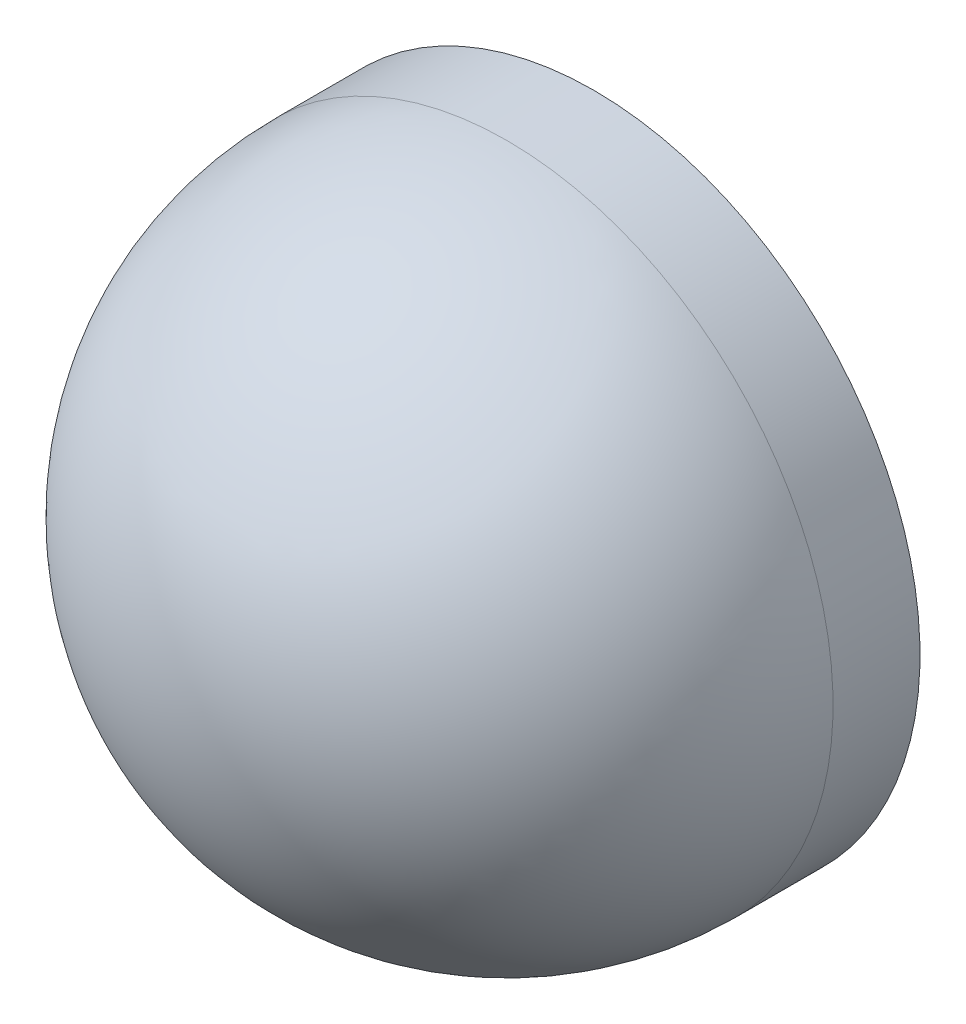
ISO-10303-21;
HEADER;
FILE_DESCRIPTION(('STEP AP214'),'2;1');
FILE_NAME('part.step','',(''),(''),'','','');
FILE_SCHEMA(('AUTOMOTIVE_DESIGN { 1 0 10303 214 1 1 1 1 }'));
ENDSEC;
DATA;
#1=APPLICATION_CONTEXT('core data for automotive mechanical design processes');
#2=APPLICATION_PROTOCOL_DEFINITION('international standard','automotive_design',2000,#1);
#3=PRODUCT_CONTEXT('',#1,'mechanical');
#4=PRODUCT('Part','Part','',(#3));
#5=PRODUCT_RELATED_PRODUCT_CATEGORY('part','',(#4));
#6=PRODUCT_DEFINITION_FORMATION('','',#4);
#7=PRODUCT_DEFINITION_CONTEXT('part definition',#1,'design');
#8=PRODUCT_DEFINITION('design','',#6,#7);
#9=PRODUCT_DEFINITION_SHAPE('','',#8);
#10=(LENGTH_UNIT() NAMED_UNIT(*) SI_UNIT(.MILLI.,.METRE.));
#11=(NAMED_UNIT(*) PLANE_ANGLE_UNIT() SI_UNIT($,.RADIAN.));
#12=(NAMED_UNIT(*) SI_UNIT($,.STERADIAN.) SOLID_ANGLE_UNIT());
#13=UNCERTAINTY_MEASURE_WITH_UNIT(LENGTH_MEASURE(1.E-05),#10,'distance_accuracy_value','');
#14=(GEOMETRIC_REPRESENTATION_CONTEXT(3) GLOBAL_UNCERTAINTY_ASSIGNED_CONTEXT((#13)) GLOBAL_UNIT_ASSIGNED_CONTEXT((#10,
#11,#12)) REPRESENTATION_CONTEXT('',''));
#15=CARTESIAN_POINT('',(0.,0.,0.));
#16=DIRECTION('',(0.,0.,1.));
#17=DIRECTION('',(1.,0.,0.));
#18=AXIS2_PLACEMENT_3D('',#15,#16,#17);
#19=CARTESIAN_POINT('',(0.,0.,0.8));
#20=DIRECTION('',(0.,0.,-1.));
#21=DIRECTION('',(0.,1.,0.));
#22=AXIS2_PLACEMENT_3D('',#19,#20,#21);
#23=SPHERICAL_SURFACE('',#22,3.);
#24=CARTESIAN_POINT('',(0.,0.,0.8));
#25=DIRECTION('',(0.,0.,-1.));
#26=DIRECTION('',(0.,1.,0.));
#27=AXIS2_PLACEMENT_3D('',#24,#25,#26);
#28=CIRCLE('',#27,3.);
#29=CARTESIAN_POINT('',(0.,3.,0.8));
#30=VERTEX_POINT('',#29);
#31=EDGE_CURVE('E40',#30,#30,#28,.T.);
#32=ORIENTED_EDGE('',*,*,#31,.F.);
#33=EDGE_LOOP('',(#32));
#34=FACE_BOUND('',#33,.T.);
#35=ADVANCED_FACE('F33',(#34),#23,.T.);
#36=CARTESIAN_POINT('',(0.,3.,0.));
#37=DIRECTION('',(0.,0.,-1.));
#38=DIRECTION('',(0.,1.,0.));
#39=AXIS2_PLACEMENT_3D('',#36,#37,#38);
#40=PLANE('',#39);
#41=DIRECTION('',(0.,-1.,0.));
#42=VECTOR('',#41,1.);
#43=CARTESIAN_POINT('',(1.65,1.45,0.));
#44=LINE('',#43,#42);
#45=CARTESIAN_POINT('',(1.65,1.45,0.));
#46=VERTEX_POINT('',#45);
#47=CARTESIAN_POINT('',(1.65,-1.45,0.));
#48=VERTEX_POINT('',#47);
#49=EDGE_CURVE('E47',#46,#48,#44,.T.);
#50=ORIENTED_EDGE('',*,*,#49,.F.);
#51=DIRECTION('',(1.,0.,0.));
#52=VECTOR('',#51,1.);
#53=CARTESIAN_POINT('',(-1.65,1.45,0.));
#54=LINE('',#53,#52);
#55=CARTESIAN_POINT('',(-1.65,1.45,0.));
#56=VERTEX_POINT('',#55);
#57=EDGE_CURVE('E98',#56,#46,#54,.T.);
#58=ORIENTED_EDGE('',*,*,#57,.F.);
#59=DIRECTION('',(0.,1.,0.));
#60=VECTOR('',#59,1.);
#61=CARTESIAN_POINT('',(-1.65,1.45,0.));
#62=LINE('',#61,#60);
#63=CARTESIAN_POINT('',(-1.65,-1.45,0.));
#64=VERTEX_POINT('',#63);
#65=EDGE_CURVE('E104',#64,#56,#62,.T.);
#66=ORIENTED_EDGE('',*,*,#65,.F.);
#67=DIRECTION('',(-1.,0.,0.));
#68=VECTOR('',#67,1.);
#69=CARTESIAN_POINT('',(-1.65,-1.45,0.));
#70=LINE('',#69,#68);
#71=EDGE_CURVE('E82',#48,#64,#70,.T.);
#72=ORIENTED_EDGE('',*,*,#71,.F.);
#73=EDGE_LOOP('',(#50,#58,#66,#72));
#74=FACE_BOUND('',#73,.T.);
#75=CARTESIAN_POINT('',(0.,0.,0.));
#76=DIRECTION('',(0.,0.,-1.));
#77=DIRECTION('',(0.,1.,0.));
#78=AXIS2_PLACEMENT_3D('',#75,#76,#77);
#79=CIRCLE('',#78,3.);
#80=CARTESIAN_POINT('',(0.,3.,0.));
#81=VERTEX_POINT('',#80);
#82=EDGE_CURVE('E11',#81,#81,#79,.T.);
#83=ORIENTED_EDGE('',*,*,#82,.T.);
#84=EDGE_LOOP('',(#83));
#85=FACE_BOUND('',#84,.T.);
#86=ADVANCED_FACE('F116',(#74,#85),#40,.T.);
#87=CARTESIAN_POINT('',(0.,0.,0.8));
#88=DIRECTION('',(0.,0.,-1.));
#89=DIRECTION('',(0.,1.,0.));
#90=AXIS2_PLACEMENT_3D('',#87,#88,#89);
#91=CYLINDRICAL_SURFACE('',#90,3.);
#92=ORIENTED_EDGE('',*,*,#31,.T.);
#93=EDGE_LOOP('',(#92));
#94=FACE_BOUND('',#93,.T.);
#95=ORIENTED_EDGE('',*,*,#82,.F.);
#96=EDGE_LOOP('',(#95));
#97=FACE_BOUND('',#96,.T.);
#98=ADVANCED_FACE('F112',(#94,#97),#91,.T.);
#99=CARTESIAN_POINT('',(1.65,1.45,2.5));
#100=DIRECTION('',(1.,0.,0.));
#101=DIRECTION('',(0.,1.,0.));
#102=AXIS2_PLACEMENT_3D('',#99,#100,#101);
#103=PLANE('',#102);
#104=ORIENTED_EDGE('',*,*,#49,.T.);
#105=DIRECTION('',(0.,0.,-1.));
#106=VECTOR('',#105,1.);
#107=CARTESIAN_POINT('',(1.65,-1.45,2.5));
#108=LINE('',#107,#106);
#109=CARTESIAN_POINT('',(1.65,-1.45,2.5));
#110=VERTEX_POINT('',#109);
#111=EDGE_CURVE('E70',#110,#48,#108,.T.);
#112=ORIENTED_EDGE('',*,*,#111,.F.);
#113=DIRECTION('',(0.,-1.,0.));
#114=VECTOR('',#113,1.);
#115=CARTESIAN_POINT('',(1.65,1.45,2.5));
#116=LINE('',#115,#114);
#117=CARTESIAN_POINT('',(1.65,1.45,2.5));
#118=VERTEX_POINT('',#117);
#119=EDGE_CURVE('E96',#118,#110,#116,.T.);
#120=ORIENTED_EDGE('',*,*,#119,.F.);
#121=DIRECTION('',(0.,0.,-1.));
#122=VECTOR('',#121,1.);
#123=CARTESIAN_POINT('',(1.65,1.45,2.5));
#124=LINE('',#123,#122);
#125=EDGE_CURVE('E55',#118,#46,#124,.T.);
#126=ORIENTED_EDGE('',*,*,#125,.T.);
#127=EDGE_LOOP('',(#104,#112,#120,#126));
#128=FACE_BOUND('',#127,.T.);
#129=ADVANCED_FACE('F124',(#128),#103,.F.);
#130=CARTESIAN_POINT('',(-1.65,1.45,2.5));
#131=DIRECTION('',(0.,1.,0.));
#132=DIRECTION('',(0.,0.,1.));
#133=AXIS2_PLACEMENT_3D('',#130,#131,#132);
#134=PLANE('',#133);
#135=ORIENTED_EDGE('',*,*,#57,.T.);
#136=ORIENTED_EDGE('',*,*,#125,.F.);
#137=DIRECTION('',(1.,0.,0.));
#138=VECTOR('',#137,1.);
#139=CARTESIAN_POINT('',(-1.65,1.45,2.5));
#140=LINE('',#139,#138);
#141=CARTESIAN_POINT('',(-1.65,1.45,2.5));
#142=VERTEX_POINT('',#141);
#143=EDGE_CURVE('E93',#142,#118,#140,.T.);
#144=ORIENTED_EDGE('',*,*,#143,.F.);
#145=DIRECTION('',(0.,0.,-1.));
#146=VECTOR('',#145,1.);
#147=CARTESIAN_POINT('',(-1.65,1.45,2.5));
#148=LINE('',#147,#146);
#149=EDGE_CURVE('E86',#142,#56,#148,.T.);
#150=ORIENTED_EDGE('',*,*,#149,.T.);
#151=EDGE_LOOP('',(#135,#136,#144,#150));
#152=FACE_BOUND('',#151,.T.);
#153=ADVANCED_FACE('F130',(#152),#134,.F.);
#154=CARTESIAN_POINT('',(-1.65,1.45,2.5));
#155=DIRECTION('',(-1.,0.,0.));
#156=DIRECTION('',(0.,-1.,0.));
#157=AXIS2_PLACEMENT_3D('',#154,#155,#156);
#158=PLANE('',#157);
#159=ORIENTED_EDGE('',*,*,#65,.T.);
#160=ORIENTED_EDGE('',*,*,#149,.F.);
#161=DIRECTION('',(0.,1.,0.));
#162=VECTOR('',#161,1.);
#163=CARTESIAN_POINT('',(-1.65,1.45,2.5));
#164=LINE('',#163,#162);
#165=CARTESIAN_POINT('',(-1.65,-1.45,2.5));
#166=VERTEX_POINT('',#165);
#167=EDGE_CURVE('E89',#166,#142,#164,.T.);
#168=ORIENTED_EDGE('',*,*,#167,.F.);
#169=DIRECTION('',(0.,0.,-1.));
#170=VECTOR('',#169,1.);
#171=CARTESIAN_POINT('',(-1.65,-1.45,2.5));
#172=LINE('',#171,#170);
#173=EDGE_CURVE('E75',#166,#64,#172,.T.);
#174=ORIENTED_EDGE('',*,*,#173,.T.);
#175=EDGE_LOOP('',(#159,#160,#168,#174));
#176=FACE_BOUND('',#175,.T.);
#177=ADVANCED_FACE('F90',(#176),#158,.F.);
#178=CARTESIAN_POINT('',(-1.65,-1.45,2.5));
#179=DIRECTION('',(0.,-1.,0.));
#180=DIRECTION('',(0.,0.,-1.));
#181=AXIS2_PLACEMENT_3D('',#178,#179,#180);
#182=PLANE('',#181);
#183=ORIENTED_EDGE('',*,*,#71,.T.);
#184=ORIENTED_EDGE('',*,*,#173,.F.);
#185=DIRECTION('',(-1.,0.,0.));
#186=VECTOR('',#185,1.);
#187=CARTESIAN_POINT('',(-1.65,-1.45,2.5));
#188=LINE('',#187,#186);
#189=EDGE_CURVE('E79',#110,#166,#188,.T.);
#190=ORIENTED_EDGE('',*,*,#189,.F.);
#191=ORIENTED_EDGE('',*,*,#111,.T.);
#192=EDGE_LOOP('',(#183,#184,#190,#191));
#193=FACE_BOUND('',#192,.T.);
#194=ADVANCED_FACE('F77',(#193),#182,.F.);
#195=CARTESIAN_POINT('',(0.,0.,2.5));
#196=DIRECTION('',(0.,0.,1.));
#197=DIRECTION('',(0.,-1.,0.));
#198=AXIS2_PLACEMENT_3D('',#195,#196,#197);
#199=PLANE('',#198);
#200=ORIENTED_EDGE('',*,*,#119,.T.);
#201=ORIENTED_EDGE('',*,*,#189,.T.);
#202=ORIENTED_EDGE('',*,*,#167,.T.);
#203=ORIENTED_EDGE('',*,*,#143,.T.);
#204=EDGE_LOOP('',(#200,#201,#202,#203));
#205=FACE_BOUND('',#204,.T.);
#206=ADVANCED_FACE('F95',(#205),#199,.F.);
#207=CLOSED_SHELL('',(#35,#86,#98,#129,#153,#177,#194,#206));
#208=MANIFOLD_SOLID_BREP('B2',#207);
#209=ADVANCED_BREP_SHAPE_REPRESENTATION('',(#18,#208),#14);
#210=SHAPE_DEFINITION_REPRESENTATION(#9,#209);
ENDSEC;
END-ISO-10303-21;
